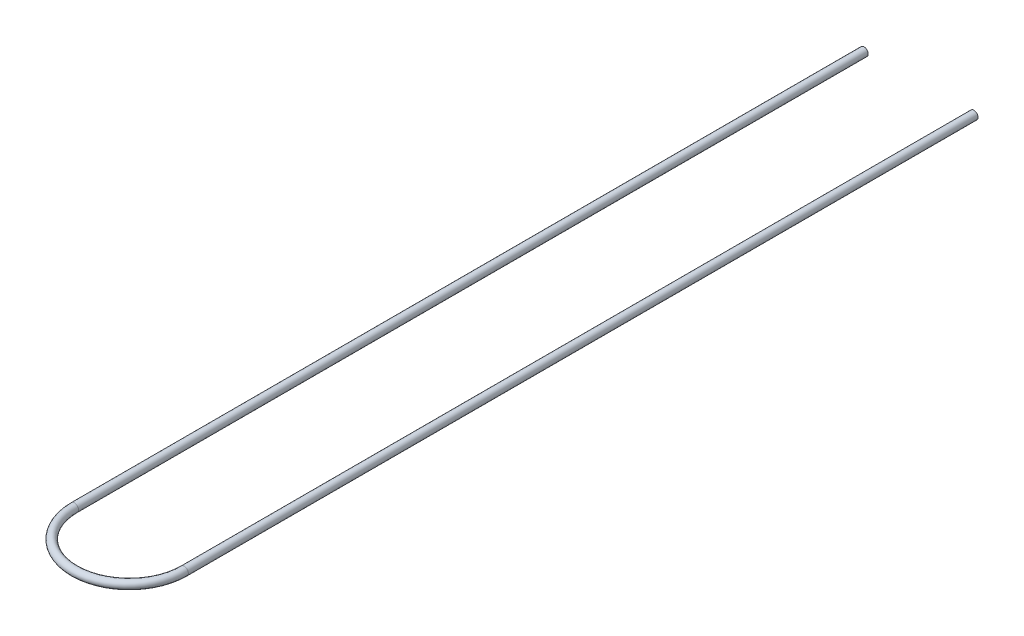
ISO-10303-21;
HEADER;
FILE_DESCRIPTION(('STEP AP214'),'2;1');
FILE_NAME('part.step','',(''),(''),'','','');
FILE_SCHEMA(('AUTOMOTIVE_DESIGN { 1 0 10303 214 1 1 1 1 }'));
ENDSEC;
DATA;
#1=APPLICATION_CONTEXT('core data for automotive mechanical design processes');
#2=APPLICATION_PROTOCOL_DEFINITION('international standard','automotive_design',2000,#1);
#3=PRODUCT_CONTEXT('',#1,'mechanical');
#4=PRODUCT('Part','Part','',(#3));
#5=PRODUCT_RELATED_PRODUCT_CATEGORY('part','',(#4));
#6=PRODUCT_DEFINITION_FORMATION('','',#4);
#7=PRODUCT_DEFINITION_CONTEXT('part definition',#1,'design');
#8=PRODUCT_DEFINITION('design','',#6,#7);
#9=PRODUCT_DEFINITION_SHAPE('','',#8);
#10=(LENGTH_UNIT() NAMED_UNIT(*) SI_UNIT(.MILLI.,.METRE.));
#11=(NAMED_UNIT(*) PLANE_ANGLE_UNIT() SI_UNIT($,.RADIAN.));
#12=(NAMED_UNIT(*) SI_UNIT($,.STERADIAN.) SOLID_ANGLE_UNIT());
#13=UNCERTAINTY_MEASURE_WITH_UNIT(LENGTH_MEASURE(1.E-05),#10,'distance_accuracy_value','');
#14=(GEOMETRIC_REPRESENTATION_CONTEXT(3) GLOBAL_UNCERTAINTY_ASSIGNED_CONTEXT((#13)) GLOBAL_UNIT_ASSIGNED_CONTEXT((#10,
#11,#12)) REPRESENTATION_CONTEXT('',''));
#15=CARTESIAN_POINT('',(0.,0.,0.));
#16=DIRECTION('',(0.,0.,1.));
#17=DIRECTION('',(1.,0.,0.));
#18=AXIS2_PLACEMENT_3D('',#15,#16,#17);
#19=CARTESIAN_POINT('',(-40.,0.,299.999999999999));
#20=DIRECTION('',(0.,0.,1.));
#21=DIRECTION('',(1.,0.,0.));
#22=AXIS2_PLACEMENT_3D('',#19,#20,#21);
#23=CYLINDRICAL_SURFACE('',#22,11.1);
#24=CARTESIAN_POINT('',(-39.9999999999997,0.,2440.));
#25=DIRECTION('',(0.,0.,1.));
#26=DIRECTION('',(1.,0.,0.));
#27=AXIS2_PLACEMENT_3D('',#24,#25,#26);
#28=CIRCLE('',#27,11.1);
#29=CARTESIAN_POINT('',(-51.0999999999996,0.,2440.));
#30=VERTEX_POINT('',#29);
#31=EDGE_CURVE('E54',#30,#30,#28,.T.);
#32=ORIENTED_EDGE('',*,*,#31,.F.);
#33=EDGE_LOOP('',(#32));
#34=FACE_BOUND('',#33,.T.);
#35=CARTESIAN_POINT('',(-40.,0.,299.999999999999));
#36=DIRECTION('',(0.,0.,1.));
#37=DIRECTION('',(1.,0.,0.));
#38=AXIS2_PLACEMENT_3D('',#35,#36,#37);
#39=CIRCLE('',#38,11.1);
#40=CARTESIAN_POINT('',(-28.9,0.,299.999999999999));
#41=VERTEX_POINT('',#40);
#42=EDGE_CURVE('E52',#41,#41,#39,.T.);
#43=ORIENTED_EDGE('',*,*,#42,.T.);
#44=EDGE_LOOP('',(#43));
#45=FACE_BOUND('',#44,.T.);
#46=ADVANCED_FACE('F31',(#34,#45),#23,.T.);
#47=CARTESIAN_POINT('',(108.77,0.,2440.));
#48=DIRECTION('',(0.,1.,0.));
#49=DIRECTION('',(0.,0.,1.));
#50=AXIS2_PLACEMENT_3D('',#47,#48,#49);
#51=TOROIDAL_SURFACE('',#50,148.77,11.1);
#52=CARTESIAN_POINT('',(257.54,0.,2440.));
#53=DIRECTION('',(0.,0.,-1.));
#54=DIRECTION('',(-1.,0.,0.));
#55=AXIS2_PLACEMENT_3D('',#52,#53,#54);
#56=CIRCLE('',#55,11.1);
#57=CARTESIAN_POINT('',(268.64,0.,2440.));
#58=VERTEX_POINT('',#57);
#59=EDGE_CURVE('E35',#58,#58,#56,.T.);
#60=CARTESIAN_POINT('',(108.77,0.,2440.));
#61=DIRECTION('',(0.,1.,0.));
#62=DIRECTION('',(0.,0.,1.));
#63=AXIS2_PLACEMENT_3D('',#60,#61,#62);
#64=CIRCLE('',#63,159.87);
#65=EDGE_CURVE('',#30,#58,#64,.T.);
#66=ORIENTED_EDGE('',*,*,#31,.T.);
#67=ORIENTED_EDGE('',*,*,#59,.F.);
#68=ORIENTED_EDGE('',*,*,#65,.T.);
#69=ORIENTED_EDGE('',*,*,#65,.F.);
#70=EDGE_LOOP('',(#66,#68,#67,#69));
#71=FACE_BOUND('',#70,.T.);
#72=ADVANCED_FACE('F62',(#71),#51,.T.);
#73=CARTESIAN_POINT('',(257.54,0.,2440.));
#74=DIRECTION('',(0.,0.,-1.));
#75=DIRECTION('',(-1.,0.,0.));
#76=AXIS2_PLACEMENT_3D('',#73,#74,#75);
#77=CYLINDRICAL_SURFACE('',#76,11.1);
#78=CARTESIAN_POINT('',(257.54,0.,299.999999999999));
#79=DIRECTION('',(0.,0.,-1.));
#80=DIRECTION('',(-1.,0.,0.));
#81=AXIS2_PLACEMENT_3D('',#78,#79,#80);
#82=CIRCLE('',#81,11.1);
#83=CARTESIAN_POINT('',(246.44,0.,299.999999999999));
#84=VERTEX_POINT('',#83);
#85=EDGE_CURVE('E48',#84,#84,#82,.T.);
#86=ORIENTED_EDGE('',*,*,#85,.F.);
#87=EDGE_LOOP('',(#86));
#88=FACE_BOUND('',#87,.T.);
#89=ORIENTED_EDGE('',*,*,#59,.T.);
#90=EDGE_LOOP('',(#89));
#91=FACE_BOUND('',#90,.T.);
#92=ADVANCED_FACE('F33',(#88,#91),#77,.T.);
#93=CARTESIAN_POINT('',(-40.,0.,299.999999999999));
#94=DIRECTION('',(0.,0.,1.));
#95=DIRECTION('',(1.,0.,0.));
#96=AXIS2_PLACEMENT_3D('',#93,#94,#95);
#97=PLANE('',#96);
#98=CARTESIAN_POINT('',(-40.,0.,299.999999999999));
#99=DIRECTION('',(0.,0.,1.));
#100=DIRECTION('',(1.,0.,0.));
#101=AXIS2_PLACEMENT_3D('',#98,#99,#100);
#102=CIRCLE('',#101,9.95000000000001);
#103=CARTESIAN_POINT('',(-30.05,0.,299.999999999999));
#104=VERTEX_POINT('',#103);
#105=EDGE_CURVE('E51',#104,#104,#102,.F.);
#106=ORIENTED_EDGE('',*,*,#105,.F.);
#107=EDGE_LOOP('',(#106));
#108=FACE_BOUND('',#107,.T.);
#109=ORIENTED_EDGE('',*,*,#42,.F.);
#110=EDGE_LOOP('',(#109));
#111=FACE_BOUND('',#110,.T.);
#112=ADVANCED_FACE('F68',(#108,#111),#97,.F.);
#113=CARTESIAN_POINT('',(257.54,0.,299.999999999999));
#114=DIRECTION('',(0.,0.,-1.));
#115=DIRECTION('',(-1.,0.,0.));
#116=AXIS2_PLACEMENT_3D('',#113,#114,#115);
#117=PLANE('',#116);
#118=CARTESIAN_POINT('',(257.54,0.,299.999999999999));
#119=DIRECTION('',(0.,0.,-1.));
#120=DIRECTION('',(-1.,0.,0.));
#121=AXIS2_PLACEMENT_3D('',#118,#119,#120);
#122=CIRCLE('',#121,9.95000000000001);
#123=CARTESIAN_POINT('',(247.59,0.,299.999999999999));
#124=VERTEX_POINT('',#123);
#125=EDGE_CURVE('E10',#124,#124,#122,.F.);
#126=ORIENTED_EDGE('',*,*,#125,.T.);
#127=EDGE_LOOP('',(#126));
#128=FACE_BOUND('',#127,.T.);
#129=ORIENTED_EDGE('',*,*,#85,.T.);
#130=EDGE_LOOP('',(#129));
#131=FACE_BOUND('',#130,.T.);
#132=ADVANCED_FACE('F86',(#128,#131),#117,.T.);
#133=CARTESIAN_POINT('',(-40.,0.,299.999999999999));
#134=DIRECTION('',(0.,0.,1.));
#135=DIRECTION('',(1.,0.,0.));
#136=AXIS2_PLACEMENT_3D('',#133,#134,#135);
#137=CYLINDRICAL_SURFACE('',#136,9.95000000000001);
#138=CARTESIAN_POINT('',(-39.9999999999997,0.,2440.));
#139=DIRECTION('',(0.,0.,1.));
#140=DIRECTION('',(1.,0.,0.));
#141=AXIS2_PLACEMENT_3D('',#138,#139,#140);
#142=CIRCLE('',#141,9.95000000000001);
#143=CARTESIAN_POINT('',(-49.9499999999997,0.,2440.));
#144=VERTEX_POINT('',#143);
#145=EDGE_CURVE('E44',#144,#144,#142,.F.);
#146=ORIENTED_EDGE('',*,*,#145,.F.);
#147=EDGE_LOOP('',(#146));
#148=FACE_BOUND('',#147,.T.);
#149=ORIENTED_EDGE('',*,*,#105,.T.);
#150=EDGE_LOOP('',(#149));
#151=FACE_BOUND('',#150,.T.);
#152=ADVANCED_FACE('F80',(#148,#151),#137,.F.);
#153=CARTESIAN_POINT('',(108.77,0.,2440.));
#154=DIRECTION('',(0.,1.,0.));
#155=DIRECTION('',(0.,0.,1.));
#156=AXIS2_PLACEMENT_3D('',#153,#154,#155);
#157=TOROIDAL_SURFACE('',#156,148.77,9.95000000000001);
#158=CARTESIAN_POINT('',(257.54,0.,2440.));
#159=DIRECTION('',(0.,0.,-1.));
#160=DIRECTION('',(-1.,0.,0.));
#161=AXIS2_PLACEMENT_3D('',#158,#159,#160);
#162=CIRCLE('',#161,9.95000000000001);
#163=CARTESIAN_POINT('',(267.49,0.,2440.));
#164=VERTEX_POINT('',#163);
#165=EDGE_CURVE('E39',#164,#164,#162,.F.);
#166=CARTESIAN_POINT('',(108.77,0.,2440.));
#167=DIRECTION('',(0.,1.,0.));
#168=DIRECTION('',(0.,0.,1.));
#169=AXIS2_PLACEMENT_3D('',#166,#167,#168);
#170=CIRCLE('',#169,158.72);
#171=EDGE_CURVE('',#144,#164,#170,.T.);
#172=ORIENTED_EDGE('',*,*,#145,.T.);
#173=ORIENTED_EDGE('',*,*,#165,.F.);
#174=ORIENTED_EDGE('',*,*,#171,.T.);
#175=ORIENTED_EDGE('',*,*,#171,.F.);
#176=EDGE_LOOP('',(#172,#174,#173,#175));
#177=FACE_BOUND('',#176,.T.);
#178=ADVANCED_FACE('F74',(#177),#157,.F.);
#179=CARTESIAN_POINT('',(257.54,0.,2440.));
#180=DIRECTION('',(0.,0.,-1.));
#181=DIRECTION('',(-1.,0.,0.));
#182=AXIS2_PLACEMENT_3D('',#179,#180,#181);
#183=CYLINDRICAL_SURFACE('',#182,9.95000000000001);
#184=ORIENTED_EDGE('',*,*,#125,.F.);
#185=EDGE_LOOP('',(#184));
#186=FACE_BOUND('',#185,.T.);
#187=ORIENTED_EDGE('',*,*,#165,.T.);
#188=EDGE_LOOP('',(#187));
#189=FACE_BOUND('',#188,.T.);
#190=ADVANCED_FACE('F72',(#186,#189),#183,.F.);
#191=CLOSED_SHELL('',(#46,#72,#92,#112,#132,#152,#178,#190));
#192=MANIFOLD_SOLID_BREP('B2',#191);
#193=ADVANCED_BREP_SHAPE_REPRESENTATION('',(#18,#192),#14);
#194=SHAPE_DEFINITION_REPRESENTATION(#9,#193);
ENDSEC;
END-ISO-10303-21;
